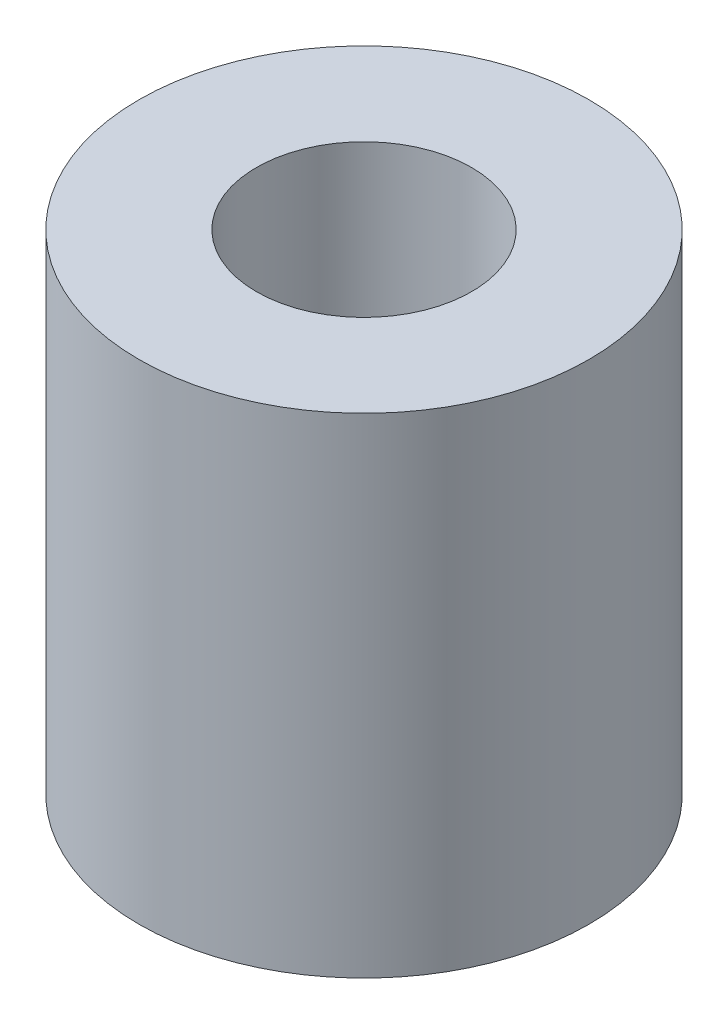
ISO-10303-21;
HEADER;
FILE_DESCRIPTION(('STEP AP214'),'2;1');
FILE_NAME('part.step','',(''),(''),'','','');
FILE_SCHEMA(('AUTOMOTIVE_DESIGN { 1 0 10303 214 1 1 1 1 }'));
ENDSEC;
DATA;
#1=APPLICATION_CONTEXT('core data for automotive mechanical design processes');
#2=APPLICATION_PROTOCOL_DEFINITION('international standard','automotive_design',2000,#1);
#3=PRODUCT_CONTEXT('',#1,'mechanical');
#4=PRODUCT('Part','Part','',(#3));
#5=PRODUCT_RELATED_PRODUCT_CATEGORY('part','',(#4));
#6=PRODUCT_DEFINITION_FORMATION('','',#4);
#7=PRODUCT_DEFINITION_CONTEXT('part definition',#1,'design');
#8=PRODUCT_DEFINITION('design','',#6,#7);
#9=PRODUCT_DEFINITION_SHAPE('','',#8);
#10=(LENGTH_UNIT() NAMED_UNIT(*) SI_UNIT(.MILLI.,.METRE.));
#11=(NAMED_UNIT(*) PLANE_ANGLE_UNIT() SI_UNIT($,.RADIAN.));
#12=(NAMED_UNIT(*) SI_UNIT($,.STERADIAN.) SOLID_ANGLE_UNIT());
#13=UNCERTAINTY_MEASURE_WITH_UNIT(LENGTH_MEASURE(1.E-05),#10,'distance_accuracy_value','');
#14=(GEOMETRIC_REPRESENTATION_CONTEXT(3) GLOBAL_UNCERTAINTY_ASSIGNED_CONTEXT((#13)) GLOBAL_UNIT_ASSIGNED_CONTEXT((#10,
#11,#12)) REPRESENTATION_CONTEXT('',''));
#15=CARTESIAN_POINT('',(0.,0.,0.));
#16=DIRECTION('',(0.,0.,1.));
#17=DIRECTION('',(1.,0.,0.));
#18=AXIS2_PLACEMENT_3D('',#15,#16,#17);
#19=CARTESIAN_POINT('',(0.,25.,0.));
#20=DIRECTION('',(0.,1.,0.));
#21=DIRECTION('',(0.,0.,1.));
#22=AXIS2_PLACEMENT_3D('',#19,#20,#21);
#23=PLANE('',#22);
#24=CARTESIAN_POINT('',(0.,25.,0.));
#25=DIRECTION('',(0.,1.,0.));
#26=DIRECTION('',(0.,0.,1.));
#27=AXIS2_PLACEMENT_3D('',#24,#25,#26);
#28=CIRCLE('',#27,11.5);
#29=CARTESIAN_POINT('',(0.,25.,11.5));
#30=VERTEX_POINT('',#29);
#31=EDGE_CURVE('E10',#30,#30,#28,.T.);
#32=ORIENTED_EDGE('',*,*,#31,.T.);
#33=EDGE_LOOP('',(#32));
#34=FACE_BOUND('',#33,.T.);
#35=CARTESIAN_POINT('',(0.,25.,0.));
#36=DIRECTION('',(0.,1.,0.));
#37=DIRECTION('',(0.,0.,1.));
#38=AXIS2_PLACEMENT_3D('',#35,#36,#37);
#39=CIRCLE('',#38,5.5);
#40=CARTESIAN_POINT('',(0.,25.,5.5));
#41=VERTEX_POINT('',#40);
#42=EDGE_CURVE('E50',#41,#41,#39,.T.);
#43=ORIENTED_EDGE('',*,*,#42,.F.);
#44=EDGE_LOOP('',(#43));
#45=FACE_BOUND('',#44,.T.);
#46=ADVANCED_FACE('F37',(#34,#45),#23,.T.);
#47=CARTESIAN_POINT('',(0.,0.,0.));
#48=DIRECTION('',(0.,1.,0.));
#49=DIRECTION('',(0.,0.,1.));
#50=AXIS2_PLACEMENT_3D('',#47,#48,#49);
#51=PLANE('',#50);
#52=CARTESIAN_POINT('',(0.,0.,0.));
#53=DIRECTION('',(0.,1.,0.));
#54=DIRECTION('',(0.,0.,1.));
#55=AXIS2_PLACEMENT_3D('',#52,#53,#54);
#56=CIRCLE('',#55,11.5);
#57=CARTESIAN_POINT('',(0.,0.,11.5));
#58=VERTEX_POINT('',#57);
#59=EDGE_CURVE('E41',#58,#58,#56,.T.);
#60=ORIENTED_EDGE('',*,*,#59,.F.);
#61=EDGE_LOOP('',(#60));
#62=FACE_BOUND('',#61,.T.);
#63=CARTESIAN_POINT('',(0.,0.,0.));
#64=DIRECTION('',(0.,1.,0.));
#65=DIRECTION('',(0.,0.,1.));
#66=AXIS2_PLACEMENT_3D('',#63,#64,#65);
#67=CIRCLE('',#66,5.5);
#68=CARTESIAN_POINT('',(0.,0.,5.5));
#69=VERTEX_POINT('',#68);
#70=EDGE_CURVE('E52',#69,#69,#67,.T.);
#71=ORIENTED_EDGE('',*,*,#70,.T.);
#72=EDGE_LOOP('',(#71));
#73=FACE_BOUND('',#72,.T.);
#74=ADVANCED_FACE('F64',(#62,#73),#51,.F.);
#75=CARTESIAN_POINT('',(0.,25.,0.));
#76=DIRECTION('',(0.,-1.,0.));
#77=DIRECTION('',(0.,0.,-1.));
#78=AXIS2_PLACEMENT_3D('',#75,#76,#77);
#79=CYLINDRICAL_SURFACE('',#78,11.5);
#80=ORIENTED_EDGE('',*,*,#31,.F.);
#81=EDGE_LOOP('',(#80));
#82=FACE_BOUND('',#81,.T.);
#83=ORIENTED_EDGE('',*,*,#59,.T.);
#84=EDGE_LOOP('',(#83));
#85=FACE_BOUND('',#84,.T.);
#86=ADVANCED_FACE('F39',(#82,#85),#79,.T.);
#87=CARTESIAN_POINT('',(0.,25.,0.));
#88=DIRECTION('',(0.,-1.,0.));
#89=DIRECTION('',(0.,0.,-1.));
#90=AXIS2_PLACEMENT_3D('',#87,#88,#89);
#91=CYLINDRICAL_SURFACE('',#90,5.5);
#92=ORIENTED_EDGE('',*,*,#42,.T.);
#93=EDGE_LOOP('',(#92));
#94=FACE_BOUND('',#93,.T.);
#95=ORIENTED_EDGE('',*,*,#70,.F.);
#96=EDGE_LOOP('',(#95));
#97=FACE_BOUND('',#96,.T.);
#98=ADVANCED_FACE('F60',(#94,#97),#91,.F.);
#99=CLOSED_SHELL('',(#46,#74,#86,#98));
#100=MANIFOLD_SOLID_BREP('B2',#99);
#101=ADVANCED_BREP_SHAPE_REPRESENTATION('',(#18,#100),#14);
#102=SHAPE_DEFINITION_REPRESENTATION(#9,#101);
ENDSEC;
END-ISO-10303-21;
